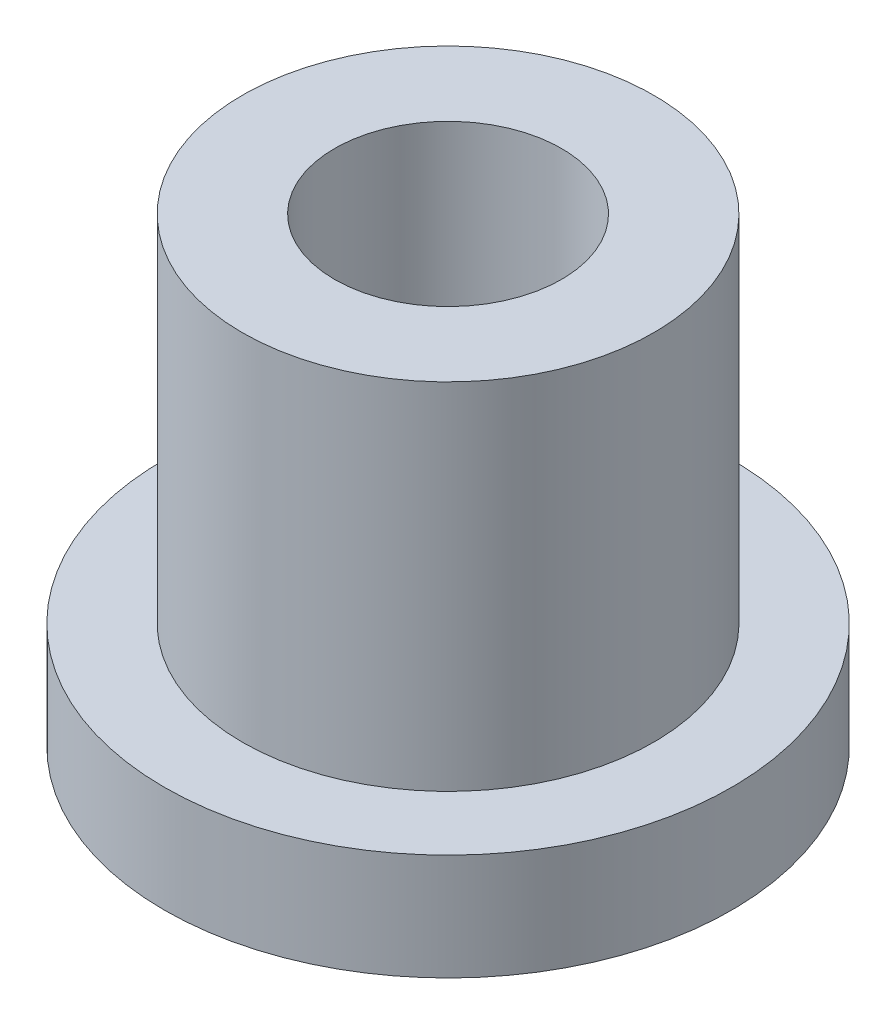
ISO-10303-21;
HEADER;
FILE_DESCRIPTION(('STEP AP214'),'2;1');
FILE_NAME('part.step','',(''),(''),'','','');
FILE_SCHEMA(('AUTOMOTIVE_DESIGN { 1 0 10303 214 1 1 1 1 }'));
ENDSEC;
DATA;
#1=APPLICATION_CONTEXT('core data for automotive mechanical design processes');
#2=APPLICATION_PROTOCOL_DEFINITION('international standard','automotive_design',2000,#1);
#3=PRODUCT_CONTEXT('',#1,'mechanical');
#4=PRODUCT('Part','Part','',(#3));
#5=PRODUCT_RELATED_PRODUCT_CATEGORY('part','',(#4));
#6=PRODUCT_DEFINITION_FORMATION('','',#4);
#7=PRODUCT_DEFINITION_CONTEXT('part definition',#1,'design');
#8=PRODUCT_DEFINITION('design','',#6,#7);
#9=PRODUCT_DEFINITION_SHAPE('','',#8);
#10=(LENGTH_UNIT() NAMED_UNIT(*) SI_UNIT(.MILLI.,.METRE.));
#11=(NAMED_UNIT(*) PLANE_ANGLE_UNIT() SI_UNIT($,.RADIAN.));
#12=(NAMED_UNIT(*) SI_UNIT($,.STERADIAN.) SOLID_ANGLE_UNIT());
#13=UNCERTAINTY_MEASURE_WITH_UNIT(LENGTH_MEASURE(1.E-05),#10,'distance_accuracy_value','');
#14=(GEOMETRIC_REPRESENTATION_CONTEXT(3) GLOBAL_UNCERTAINTY_ASSIGNED_CONTEXT((#13)) GLOBAL_UNIT_ASSIGNED_CONTEXT((#10,
#11,#12)) REPRESENTATION_CONTEXT('',''));
#15=CARTESIAN_POINT('',(0.,0.,0.));
#16=DIRECTION('',(0.,0.,1.));
#17=DIRECTION('',(1.,0.,0.));
#18=AXIS2_PLACEMENT_3D('',#15,#16,#17);
#19=CARTESIAN_POINT('',(0.,1.5,0.));
#20=DIRECTION('',(0.,-1.,0.));
#21=DIRECTION('',(0.,0.,-1.));
#22=AXIS2_PLACEMENT_3D('',#19,#20,#21);
#23=CYLINDRICAL_SURFACE('',#22,4.);
#24=CARTESIAN_POINT('',(0.,1.5,0.));
#25=DIRECTION('',(0.,1.,0.));
#26=DIRECTION('',(0.,0.,1.));
#27=AXIS2_PLACEMENT_3D('',#24,#25,#26);
#28=CIRCLE('',#27,4.);
#29=CARTESIAN_POINT('',(0.,1.5,4.));
#30=VERTEX_POINT('',#29);
#31=EDGE_CURVE('E39',#30,#30,#28,.T.);
#32=ORIENTED_EDGE('',*,*,#31,.F.);
#33=EDGE_LOOP('',(#32));
#34=FACE_BOUND('',#33,.T.);
#35=CARTESIAN_POINT('',(0.,0.,0.));
#36=DIRECTION('',(0.,1.,0.));
#37=DIRECTION('',(0.,0.,1.));
#38=AXIS2_PLACEMENT_3D('',#35,#36,#37);
#39=CIRCLE('',#38,4.);
#40=CARTESIAN_POINT('',(0.,0.,4.));
#41=VERTEX_POINT('',#40);
#42=EDGE_CURVE('E35',#41,#41,#39,.T.);
#43=ORIENTED_EDGE('',*,*,#42,.T.);
#44=EDGE_LOOP('',(#43));
#45=FACE_BOUND('',#44,.T.);
#46=ADVANCED_FACE('F32',(#34,#45),#23,.T.);
#47=CARTESIAN_POINT('',(0.,1.5,0.));
#48=DIRECTION('',(0.,1.,0.));
#49=DIRECTION('',(0.,0.,1.));
#50=AXIS2_PLACEMENT_3D('',#47,#48,#49);
#51=PLANE('',#50);
#52=CARTESIAN_POINT('',(0.,1.5,0.));
#53=DIRECTION('',(0.,1.,0.));
#54=DIRECTION('',(0.,0.,1.));
#55=AXIS2_PLACEMENT_3D('',#52,#53,#54);
#56=CIRCLE('',#55,2.9);
#57=CARTESIAN_POINT('',(0.,1.5,2.9));
#58=VERTEX_POINT('',#57);
#59=EDGE_CURVE('E10',#58,#58,#56,.T.);
#60=ORIENTED_EDGE('',*,*,#59,.F.);
#61=EDGE_LOOP('',(#60));
#62=FACE_BOUND('',#61,.T.);
#63=ORIENTED_EDGE('',*,*,#31,.T.);
#64=EDGE_LOOP('',(#63));
#65=FACE_BOUND('',#64,.T.);
#66=ADVANCED_FACE('F71',(#62,#65),#51,.T.);
#67=CARTESIAN_POINT('',(0.,0.,0.));
#68=DIRECTION('',(0.,1.,0.));
#69=DIRECTION('',(0.,0.,1.));
#70=AXIS2_PLACEMENT_3D('',#67,#68,#69);
#71=PLANE('',#70);
#72=CARTESIAN_POINT('',(0.,0.,0.));
#73=DIRECTION('',(0.,1.,0.));
#74=DIRECTION('',(0.,0.,1.));
#75=AXIS2_PLACEMENT_3D('',#72,#73,#74);
#76=CIRCLE('',#75,1.6);
#77=CARTESIAN_POINT('',(0.,0.,1.6));
#78=VERTEX_POINT('',#77);
#79=EDGE_CURVE('E48',#78,#78,#76,.F.);
#80=ORIENTED_EDGE('',*,*,#79,.F.);
#81=EDGE_LOOP('',(#80));
#82=FACE_BOUND('',#81,.T.);
#83=ORIENTED_EDGE('',*,*,#42,.F.);
#84=EDGE_LOOP('',(#83));
#85=FACE_BOUND('',#84,.T.);
#86=ADVANCED_FACE('F66',(#82,#85),#71,.F.);
#87=CARTESIAN_POINT('',(0.,6.5,0.));
#88=DIRECTION('',(0.,-1.,0.));
#89=DIRECTION('',(0.,0.,-1.));
#90=AXIS2_PLACEMENT_3D('',#87,#88,#89);
#91=CYLINDRICAL_SURFACE('',#90,2.9);
#92=CARTESIAN_POINT('',(0.,6.5,0.));
#93=DIRECTION('',(0.,1.,0.));
#94=DIRECTION('',(0.,0.,1.));
#95=AXIS2_PLACEMENT_3D('',#92,#93,#94);
#96=CIRCLE('',#95,2.9);
#97=CARTESIAN_POINT('',(0.,6.5,2.9));
#98=VERTEX_POINT('',#97);
#99=EDGE_CURVE('E45',#98,#98,#96,.T.);
#100=ORIENTED_EDGE('',*,*,#99,.F.);
#101=EDGE_LOOP('',(#100));
#102=FACE_BOUND('',#101,.T.);
#103=ORIENTED_EDGE('',*,*,#59,.T.);
#104=EDGE_LOOP('',(#103));
#105=FACE_BOUND('',#104,.T.);
#106=ADVANCED_FACE('F61',(#102,#105),#91,.T.);
#107=CARTESIAN_POINT('',(0.,6.5,0.));
#108=DIRECTION('',(0.,1.,0.));
#109=DIRECTION('',(0.,0.,1.));
#110=AXIS2_PLACEMENT_3D('',#107,#108,#109);
#111=PLANE('',#110);
#112=CARTESIAN_POINT('',(0.,6.5,0.));
#113=DIRECTION('',(0.,1.,0.));
#114=DIRECTION('',(0.,0.,1.));
#115=AXIS2_PLACEMENT_3D('',#112,#113,#114);
#116=CIRCLE('',#115,1.6);
#117=CARTESIAN_POINT('',(0.,6.5,1.6));
#118=VERTEX_POINT('',#117);
#119=EDGE_CURVE('E51',#118,#118,#116,.T.);
#120=ORIENTED_EDGE('',*,*,#119,.F.);
#121=EDGE_LOOP('',(#120));
#122=FACE_BOUND('',#121,.T.);
#123=ORIENTED_EDGE('',*,*,#99,.T.);
#124=EDGE_LOOP('',(#123));
#125=FACE_BOUND('',#124,.T.);
#126=ADVANCED_FACE('F58',(#122,#125),#111,.T.);
#127=CARTESIAN_POINT('',(0.,-0.00100000000000013,0.));
#128=DIRECTION('',(0.,1.,0.));
#129=DIRECTION('',(0.,0.,1.));
#130=AXIS2_PLACEMENT_3D('',#127,#128,#129);
#131=CYLINDRICAL_SURFACE('',#130,1.6);
#132=ORIENTED_EDGE('',*,*,#119,.T.);
#133=EDGE_LOOP('',(#132));
#134=FACE_BOUND('',#133,.T.);
#135=ORIENTED_EDGE('',*,*,#79,.T.);
#136=EDGE_LOOP('',(#135));
#137=FACE_BOUND('',#136,.T.);
#138=ADVANCED_FACE('F55',(#134,#137),#131,.F.);
#139=CLOSED_SHELL('',(#46,#66,#86,#106,#126,#138));
#140=MANIFOLD_SOLID_BREP('B2',#139);
#141=ADVANCED_BREP_SHAPE_REPRESENTATION('',(#18,#140),#14);
#142=SHAPE_DEFINITION_REPRESENTATION(#9,#141);
ENDSEC;
END-ISO-10303-21;
